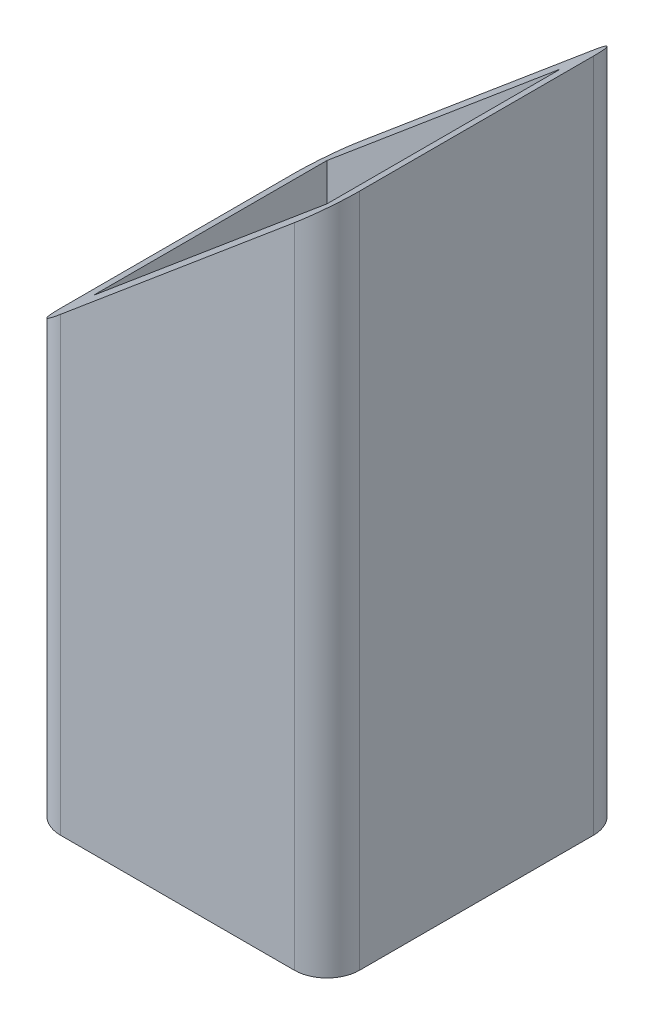
ISO-10303-21;
HEADER;
FILE_DESCRIPTION(('STEP AP214'),'2;1');
FILE_NAME('part.step','',(''),(''),'','','');
FILE_SCHEMA(('AUTOMOTIVE_DESIGN { 1 0 10303 214 1 1 1 1 }'));
ENDSEC;
DATA;
#1=APPLICATION_CONTEXT('core data for automotive mechanical design processes');
#2=APPLICATION_PROTOCOL_DEFINITION('international standard','automotive_design',2000,#1);
#3=PRODUCT_CONTEXT('',#1,'mechanical');
#4=PRODUCT('Part','Part','',(#3));
#5=PRODUCT_RELATED_PRODUCT_CATEGORY('part','',(#4));
#6=PRODUCT_DEFINITION_FORMATION('','',#4);
#7=PRODUCT_DEFINITION_CONTEXT('part definition',#1,'design');
#8=PRODUCT_DEFINITION('design','',#6,#7);
#9=PRODUCT_DEFINITION_SHAPE('','',#8);
#10=(LENGTH_UNIT() NAMED_UNIT(*) SI_UNIT(.MILLI.,.METRE.));
#11=(NAMED_UNIT(*) PLANE_ANGLE_UNIT() SI_UNIT($,.RADIAN.));
#12=(NAMED_UNIT(*) SI_UNIT($,.STERADIAN.) SOLID_ANGLE_UNIT());
#13=UNCERTAINTY_MEASURE_WITH_UNIT(LENGTH_MEASURE(1.E-05),#10,'distance_accuracy_value','');
#14=(GEOMETRIC_REPRESENTATION_CONTEXT(3) GLOBAL_UNCERTAINTY_ASSIGNED_CONTEXT((#13)) GLOBAL_UNIT_ASSIGNED_CONTEXT((#10,
#11,#12)) REPRESENTATION_CONTEXT('',''));
#15=CARTESIAN_POINT('',(0.,0.,0.));
#16=DIRECTION('',(0.,0.,1.));
#17=DIRECTION('',(1.,0.,0.));
#18=AXIS2_PLACEMENT_3D('',#15,#16,#17);
#19=CARTESIAN_POINT('',(22.8,60.,2.8));
#20=DIRECTION('',(0.,-1.,0.));
#21=DIRECTION('',(0.,0.,-1.));
#22=AXIS2_PLACEMENT_3D('',#19,#20,#21);
#23=CYLINDRICAL_SURFACE('',#22,2.8);
#24=DIRECTION('',(0.,-1.,0.));
#25=VECTOR('',#24,1.);
#26=CARTESIAN_POINT('',(22.8,60.,0.));
#27=LINE('',#26,#25);
#28=CARTESIAN_POINT('',(22.8,55.3674343113641,0.));
#29=VERTEX_POINT('',#28);
#30=CARTESIAN_POINT('',(22.8,0.,0.));
#31=VERTEX_POINT('',#30);
#32=EDGE_CURVE('E41',#29,#31,#27,.T.);
#33=ORIENTED_EDGE('',*,*,#32,.F.);
#34=CARTESIAN_POINT('',(22.8,55.3674343113642,2.8));
#35=DIRECTION('',(0.642909896112303,-0.765941815989222,0.));
#36=DIRECTION('',(-0.765941815989222,-0.642909896112303,0.));
#37=AXIS2_PLACEMENT_3D('',#34,#35,#36);
#38=ELLIPSE('',#37,3.6556301556454,2.8);
#39=CARTESIAN_POINT('',(25.6,57.7176751149551,2.80000000000002));
#40=VERTEX_POINT('',#39);
#41=EDGE_CURVE('E119',#29,#40,#38,.T.);
#42=ORIENTED_EDGE('',*,*,#41,.T.);
#43=DIRECTION('',(0.,-1.,0.));
#44=VECTOR('',#43,1.);
#45=CARTESIAN_POINT('',(25.6,60.,2.80000000000002));
#46=LINE('',#45,#44);
#47=CARTESIAN_POINT('',(25.6,0.,2.80000000000002));
#48=VERTEX_POINT('',#47);
#49=EDGE_CURVE('E154',#40,#48,#46,.T.);
#50=ORIENTED_EDGE('',*,*,#49,.T.);
#51=CARTESIAN_POINT('',(22.8,0.,2.8));
#52=DIRECTION('',(0.,1.,0.));
#53=DIRECTION('',(0.,0.,-1.));
#54=AXIS2_PLACEMENT_3D('',#51,#52,#53);
#55=CIRCLE('',#54,2.8);
#56=EDGE_CURVE('E141',#48,#31,#55,.T.);
#57=ORIENTED_EDGE('',*,*,#56,.T.);
#58=EDGE_LOOP('',(#33,#42,#50,#57));
#59=FACE_BOUND('',#58,.T.);
#60=ADVANCED_FACE('F34',(#59),#23,.T.);
#61=CARTESIAN_POINT('',(2.80000000000002,60.,0.));
#62=DIRECTION('',(0.,0.,1.));
#63=DIRECTION('',(1.,0.,0.));
#64=AXIS2_PLACEMENT_3D('',#61,#62,#63);
#65=PLANE('',#64);
#66=DIRECTION('',(0.,-1.,0.));
#67=VECTOR('',#66,1.);
#68=CARTESIAN_POINT('',(2.80000000000002,60.,0.));
#69=LINE('',#68,#67);
#70=CARTESIAN_POINT('',(2.8,38.58,0.));
#71=VERTEX_POINT('',#70);
#72=CARTESIAN_POINT('',(2.80000000000002,0.,0.));
#73=VERTEX_POINT('',#72);
#74=EDGE_CURVE('E135',#71,#73,#69,.T.);
#75=ORIENTED_EDGE('',*,*,#74,.F.);
#76=DIRECTION('',(-0.765941815989222,-0.642909896112303,0.));
#77=VECTOR('',#76,1.);
#78=CARTESIAN_POINT('',(-0.986658785791405,35.4015857186988,0.));
#79=LINE('',#78,#77);
#80=EDGE_CURVE('E122',#29,#71,#79,.T.);
#81=ORIENTED_EDGE('',*,*,#80,.F.);
#82=ORIENTED_EDGE('',*,*,#32,.T.);
#83=DIRECTION('',(-1.,0.,0.));
#84=VECTOR('',#83,1.);
#85=CARTESIAN_POINT('',(2.80000000000002,0.,0.));
#86=LINE('',#85,#84);
#87=EDGE_CURVE('E174',#31,#73,#86,.T.);
#88=ORIENTED_EDGE('',*,*,#87,.T.);
#89=EDGE_LOOP('',(#75,#81,#82,#88));
#90=FACE_BOUND('',#89,.T.);
#91=ADVANCED_FACE('F132',(#90),#65,.F.);
#92=CARTESIAN_POINT('',(2.8,60.,2.8));
#93=DIRECTION('',(0.,-1.,0.));
#94=DIRECTION('',(0.,0.,-1.));
#95=AXIS2_PLACEMENT_3D('',#92,#93,#94);
#96=CYLINDRICAL_SURFACE('',#95,2.8);
#97=DIRECTION('',(0.,-1.,0.));
#98=VECTOR('',#97,1.);
#99=CARTESIAN_POINT('',(0.,60.,2.80000000000002));
#100=LINE('',#99,#98);
#101=CARTESIAN_POINT('',(0.,36.229759196409,2.80000000000002));
#102=VERTEX_POINT('',#101);
#103=CARTESIAN_POINT('',(0.,0.,2.80000000000002));
#104=VERTEX_POINT('',#103);
#105=EDGE_CURVE('E142',#102,#104,#100,.T.);
#106=ORIENTED_EDGE('',*,*,#105,.F.);
#107=CARTESIAN_POINT('',(2.8,38.58,2.8));
#108=DIRECTION('',(0.642909896112303,-0.765941815989222,0.));
#109=DIRECTION('',(-0.765941815989222,-0.642909896112303,0.));
#110=AXIS2_PLACEMENT_3D('',#107,#108,#109);
#111=ELLIPSE('',#110,3.6556301556454,2.8);
#112=EDGE_CURVE('E197',#102,#71,#111,.T.);
#113=ORIENTED_EDGE('',*,*,#112,.T.);
#114=ORIENTED_EDGE('',*,*,#74,.T.);
#115=CARTESIAN_POINT('',(2.8,0.,2.8));
#116=DIRECTION('',(0.,1.,0.));
#117=DIRECTION('',(0.,0.,1.));
#118=AXIS2_PLACEMENT_3D('',#115,#116,#117);
#119=CIRCLE('',#118,2.8);
#120=EDGE_CURVE('E171',#73,#104,#119,.T.);
#121=ORIENTED_EDGE('',*,*,#120,.T.);
#122=EDGE_LOOP('',(#106,#113,#114,#121));
#123=FACE_BOUND('',#122,.T.);
#124=ADVANCED_FACE('F242',(#123),#96,.T.);
#125=CARTESIAN_POINT('',(0.,60.,2.80000000000002));
#126=DIRECTION('',(1.,0.,0.));
#127=DIRECTION('',(0.,0.,-1.));
#128=AXIS2_PLACEMENT_3D('',#125,#126,#127);
#129=PLANE('',#128);
#130=DIRECTION('',(0.,-1.,0.));
#131=VECTOR('',#130,1.);
#132=CARTESIAN_POINT('',(0.,60.,22.8));
#133=LINE('',#132,#131);
#134=CARTESIAN_POINT('',(0.,36.229759196409,22.8));
#135=VERTEX_POINT('',#134);
#136=CARTESIAN_POINT('',(0.,0.,22.8));
#137=VERTEX_POINT('',#136);
#138=EDGE_CURVE('E146',#135,#137,#133,.T.);
#139=ORIENTED_EDGE('',*,*,#138,.F.);
#140=DIRECTION('',(0.,0.,-1.));
#141=VECTOR('',#140,1.);
#142=CARTESIAN_POINT('',(0.,36.229759196409,2.80000000000002));
#143=LINE('',#142,#141);
#144=EDGE_CURVE('E199',#135,#102,#143,.T.);
#145=ORIENTED_EDGE('',*,*,#144,.T.);
#146=ORIENTED_EDGE('',*,*,#105,.T.);
#147=DIRECTION('',(0.,0.,1.));
#148=VECTOR('',#147,1.);
#149=CARTESIAN_POINT('',(0.,0.,2.80000000000002));
#150=LINE('',#149,#148);
#151=EDGE_CURVE('E168',#104,#137,#150,.T.);
#152=ORIENTED_EDGE('',*,*,#151,.T.);
#153=EDGE_LOOP('',(#139,#145,#146,#152));
#154=FACE_BOUND('',#153,.T.);
#155=ADVANCED_FACE('F246',(#154),#129,.F.);
#156=CARTESIAN_POINT('',(2.8,60.,22.8));
#157=DIRECTION('',(0.,-1.,0.));
#158=DIRECTION('',(0.,0.,-1.));
#159=AXIS2_PLACEMENT_3D('',#156,#157,#158);
#160=CYLINDRICAL_SURFACE('',#159,2.8);
#161=DIRECTION('',(0.,-1.,0.));
#162=VECTOR('',#161,1.);
#163=CARTESIAN_POINT('',(2.80000000000002,60.,25.6));
#164=LINE('',#163,#162);
#165=CARTESIAN_POINT('',(2.80000000000002,38.58,25.6));
#166=VERTEX_POINT('',#165);
#167=CARTESIAN_POINT('',(2.80000000000002,0.,25.6));
#168=VERTEX_POINT('',#167);
#169=EDGE_CURVE('E148',#166,#168,#164,.T.);
#170=ORIENTED_EDGE('',*,*,#169,.F.);
#171=CARTESIAN_POINT('',(2.8,38.58,22.8));
#172=DIRECTION('',(0.642909896112303,-0.765941815989222,0.));
#173=DIRECTION('',(-0.765941815989222,-0.642909896112303,0.));
#174=AXIS2_PLACEMENT_3D('',#171,#172,#173);
#175=ELLIPSE('',#174,3.6556301556454,2.8);
#176=EDGE_CURVE('E128',#166,#135,#175,.T.);
#177=ORIENTED_EDGE('',*,*,#176,.T.);
#178=ORIENTED_EDGE('',*,*,#138,.T.);
#179=CARTESIAN_POINT('',(2.8,0.,22.8));
#180=DIRECTION('',(0.,1.,0.));
#181=DIRECTION('',(0.,0.,1.));
#182=AXIS2_PLACEMENT_3D('',#179,#180,#181);
#183=CIRCLE('',#182,2.8);
#184=EDGE_CURVE('E165',#137,#168,#183,.T.);
#185=ORIENTED_EDGE('',*,*,#184,.T.);
#186=EDGE_LOOP('',(#170,#177,#178,#185));
#187=FACE_BOUND('',#186,.T.);
#188=ADVANCED_FACE('F252',(#187),#160,.T.);
#189=CARTESIAN_POINT('',(2.80000000000002,60.,25.6));
#190=DIRECTION('',(0.,0.,-1.));
#191=DIRECTION('',(-1.,0.,0.));
#192=AXIS2_PLACEMENT_3D('',#189,#190,#191);
#193=PLANE('',#192);
#194=DIRECTION('',(0.,-1.,0.));
#195=VECTOR('',#194,1.);
#196=CARTESIAN_POINT('',(22.8,60.,25.6));
#197=LINE('',#196,#195);
#198=CARTESIAN_POINT('',(22.8,55.3674343113642,25.6));
#199=VERTEX_POINT('',#198);
#200=CARTESIAN_POINT('',(22.8,0.,25.6));
#201=VERTEX_POINT('',#200);
#202=EDGE_CURVE('E150',#199,#201,#197,.T.);
#203=ORIENTED_EDGE('',*,*,#202,.F.);
#204=DIRECTION('',(0.765941815989222,0.642909896112303,0.));
#205=VECTOR('',#204,1.);
#206=CARTESIAN_POINT('',(-0.986658785791405,35.4015857186988,25.6));
#207=LINE('',#206,#205);
#208=EDGE_CURVE('E137',#166,#199,#207,.T.);
#209=ORIENTED_EDGE('',*,*,#208,.F.);
#210=ORIENTED_EDGE('',*,*,#169,.T.);
#211=DIRECTION('',(1.,0.,0.));
#212=VECTOR('',#211,1.);
#213=CARTESIAN_POINT('',(2.80000000000002,0.,25.6));
#214=LINE('',#213,#212);
#215=EDGE_CURVE('E162',#168,#201,#214,.T.);
#216=ORIENTED_EDGE('',*,*,#215,.T.);
#217=EDGE_LOOP('',(#203,#209,#210,#216));
#218=FACE_BOUND('',#217,.T.);
#219=ADVANCED_FACE('F219',(#218),#193,.F.);
#220=CARTESIAN_POINT('',(22.8,60.,22.8));
#221=DIRECTION('',(0.,-1.,0.));
#222=DIRECTION('',(0.,0.,-1.));
#223=AXIS2_PLACEMENT_3D('',#220,#221,#222);
#224=CYLINDRICAL_SURFACE('',#223,2.8);
#225=DIRECTION('',(0.,-1.,0.));
#226=VECTOR('',#225,1.);
#227=CARTESIAN_POINT('',(25.6,60.,22.8));
#228=LINE('',#227,#226);
#229=CARTESIAN_POINT('',(25.6,57.7176751149551,22.8));
#230=VERTEX_POINT('',#229);
#231=CARTESIAN_POINT('',(25.6,0.,22.8));
#232=VERTEX_POINT('',#231);
#233=EDGE_CURVE('E152',#230,#232,#228,.T.);
#234=ORIENTED_EDGE('',*,*,#233,.F.);
#235=CARTESIAN_POINT('',(22.8,55.3674343113642,22.8));
#236=DIRECTION('',(0.642909896112303,-0.765941815989222,0.));
#237=DIRECTION('',(-0.765941815989222,-0.642909896112303,0.));
#238=AXIS2_PLACEMENT_3D('',#235,#236,#237);
#239=ELLIPSE('',#238,3.6556301556454,2.8);
#240=EDGE_CURVE('E48',#230,#199,#239,.T.);
#241=ORIENTED_EDGE('',*,*,#240,.T.);
#242=ORIENTED_EDGE('',*,*,#202,.T.);
#243=CARTESIAN_POINT('',(22.8,0.,22.8));
#244=DIRECTION('',(0.,1.,0.));
#245=DIRECTION('',(0.,0.,1.));
#246=AXIS2_PLACEMENT_3D('',#243,#244,#245);
#247=CIRCLE('',#246,2.8);
#248=EDGE_CURVE('E159',#201,#232,#247,.T.);
#249=ORIENTED_EDGE('',*,*,#248,.T.);
#250=EDGE_LOOP('',(#234,#241,#242,#249));
#251=FACE_BOUND('',#250,.T.);
#252=ADVANCED_FACE('F218',(#251),#224,.T.);
#253=CARTESIAN_POINT('',(25.6,60.,2.80000000000002));
#254=DIRECTION('',(-1.,0.,0.));
#255=DIRECTION('',(0.,0.,1.));
#256=AXIS2_PLACEMENT_3D('',#253,#254,#255);
#257=PLANE('',#256);
#258=ORIENTED_EDGE('',*,*,#49,.F.);
#259=DIRECTION('',(0.,0.,1.));
#260=VECTOR('',#259,1.);
#261=CARTESIAN_POINT('',(25.6,57.7176751149551,2.80000000000002));
#262=LINE('',#261,#260);
#263=EDGE_CURVE('E124',#40,#230,#262,.T.);
#264=ORIENTED_EDGE('',*,*,#263,.T.);
#265=ORIENTED_EDGE('',*,*,#233,.T.);
#266=DIRECTION('',(0.,0.,-1.));
#267=VECTOR('',#266,1.);
#268=CARTESIAN_POINT('',(25.6,0.,2.80000000000002));
#269=LINE('',#268,#267);
#270=EDGE_CURVE('E156',#232,#48,#269,.T.);
#271=ORIENTED_EDGE('',*,*,#270,.T.);
#272=EDGE_LOOP('',(#258,#264,#265,#271));
#273=FACE_BOUND('',#272,.T.);
#274=ADVANCED_FACE('F227',(#273),#257,.F.);
#275=CARTESIAN_POINT('',(22.8,0.,2.8));
#276=DIRECTION('',(0.,-1.,0.));
#277=DIRECTION('',(0.,0.,-1.));
#278=AXIS2_PLACEMENT_3D('',#275,#276,#277);
#279=PLANE('',#278);
#280=DIRECTION('',(0.,0.,1.));
#281=VECTOR('',#280,1.);
#282=CARTESIAN_POINT('',(22.8,0.,2.8));
#283=LINE('',#282,#281);
#284=CARTESIAN_POINT('',(22.8,0.,2.8));
#285=VERTEX_POINT('',#284);
#286=CARTESIAN_POINT('',(22.8,0.,22.8));
#287=VERTEX_POINT('',#286);
#288=EDGE_CURVE('E194',#285,#287,#283,.T.);
#289=ORIENTED_EDGE('',*,*,#288,.F.);
#290=DIRECTION('',(1.,0.,0.));
#291=VECTOR('',#290,1.);
#292=CARTESIAN_POINT('',(2.8,0.,2.8));
#293=LINE('',#292,#291);
#294=CARTESIAN_POINT('',(2.8,0.,2.8));
#295=VERTEX_POINT('',#294);
#296=EDGE_CURVE('E181',#295,#285,#293,.T.);
#297=ORIENTED_EDGE('',*,*,#296,.F.);
#298=DIRECTION('',(0.,0.,-1.));
#299=VECTOR('',#298,1.);
#300=CARTESIAN_POINT('',(2.8,0.,2.8));
#301=LINE('',#300,#299);
#302=CARTESIAN_POINT('',(2.8,0.,22.8));
#303=VERTEX_POINT('',#302);
#304=EDGE_CURVE('E188',#303,#295,#301,.T.);
#305=ORIENTED_EDGE('',*,*,#304,.F.);
#306=DIRECTION('',(-1.,0.,0.));
#307=VECTOR('',#306,1.);
#308=CARTESIAN_POINT('',(2.8,0.,22.8));
#309=LINE('',#308,#307);
#310=EDGE_CURVE('E191',#287,#303,#309,.T.);
#311=ORIENTED_EDGE('',*,*,#310,.F.);
#312=EDGE_LOOP('',(#289,#297,#305,#311));
#313=FACE_BOUND('',#312,.T.);
#314=ORIENTED_EDGE('',*,*,#56,.F.);
#315=ORIENTED_EDGE('',*,*,#270,.F.);
#316=ORIENTED_EDGE('',*,*,#248,.F.);
#317=ORIENTED_EDGE('',*,*,#215,.F.);
#318=ORIENTED_EDGE('',*,*,#184,.F.);
#319=ORIENTED_EDGE('',*,*,#151,.F.);
#320=ORIENTED_EDGE('',*,*,#120,.F.);
#321=ORIENTED_EDGE('',*,*,#87,.F.);
#322=EDGE_LOOP('',(#314,#315,#316,#317,#318,#319,#320,#321));
#323=FACE_BOUND('',#322,.T.);
#324=ADVANCED_FACE('F225',(#313,#323),#279,.T.);
#325=CARTESIAN_POINT('',(22.8,1040.5,2.8));
#326=DIRECTION('',(1.,0.,0.));
#327=DIRECTION('',(0.,0.,-1.));
#328=AXIS2_PLACEMENT_3D('',#325,#326,#327);
#329=PLANE('',#328);
#330=DIRECTION('',(0.,-1.,0.));
#331=VECTOR('',#330,1.);
#332=CARTESIAN_POINT('',(22.8,1040.5,22.8));
#333=LINE('',#332,#331);
#334=CARTESIAN_POINT('',(22.8,55.3674343113642,22.8));
#335=VERTEX_POINT('',#334);
#336=EDGE_CURVE('E178',#335,#287,#333,.T.);
#337=ORIENTED_EDGE('',*,*,#336,.F.);
#338=DIRECTION('',(0.,0.,-1.));
#339=VECTOR('',#338,1.);
#340=CARTESIAN_POINT('',(22.8,55.3674343113643,2.79999999999971));
#341=LINE('',#340,#339);
#342=CARTESIAN_POINT('',(22.8,55.3674343113641,2.8));
#343=VERTEX_POINT('',#342);
#344=EDGE_CURVE('E56',#335,#343,#341,.T.);
#345=ORIENTED_EDGE('',*,*,#344,.T.);
#346=DIRECTION('',(0.,-1.,0.));
#347=VECTOR('',#346,1.);
#348=CARTESIAN_POINT('',(22.8,1040.5,2.8));
#349=LINE('',#348,#347);
#350=EDGE_CURVE('E177',#343,#285,#349,.T.);
#351=ORIENTED_EDGE('',*,*,#350,.T.);
#352=ORIENTED_EDGE('',*,*,#288,.T.);
#353=EDGE_LOOP('',(#337,#345,#351,#352));
#354=FACE_BOUND('',#353,.T.);
#355=ADVANCED_FACE('F234',(#354),#329,.F.);
#356=CARTESIAN_POINT('',(2.8,1040.5,2.8));
#357=DIRECTION('',(0.,0.,-1.));
#358=DIRECTION('',(-1.,0.,0.));
#359=AXIS2_PLACEMENT_3D('',#356,#357,#358);
#360=PLANE('',#359);
#361=ORIENTED_EDGE('',*,*,#350,.F.);
#362=DIRECTION('',(-0.765941815989222,-0.642909896112303,0.));
#363=VECTOR('',#362,1.);
#364=CARTESIAN_POINT('',(496.177041966523,452.706734137409,2.80000000000007));
#365=LINE('',#364,#363);
#366=CARTESIAN_POINT('',(2.8,38.5800000000001,2.8));
#367=VERTEX_POINT('',#366);
#368=EDGE_CURVE('E207',#343,#367,#365,.T.);
#369=ORIENTED_EDGE('',*,*,#368,.T.);
#370=DIRECTION('',(0.,-1.,0.));
#371=VECTOR('',#370,1.);
#372=CARTESIAN_POINT('',(2.8,1040.5,2.8));
#373=LINE('',#372,#371);
#374=EDGE_CURVE('E183',#367,#295,#373,.T.);
#375=ORIENTED_EDGE('',*,*,#374,.T.);
#376=ORIENTED_EDGE('',*,*,#296,.T.);
#377=EDGE_LOOP('',(#361,#369,#375,#376));
#378=FACE_BOUND('',#377,.T.);
#379=ADVANCED_FACE('F280',(#378),#360,.F.);
#380=CARTESIAN_POINT('',(2.8,1040.5,2.8));
#381=DIRECTION('',(-1.,0.,0.));
#382=DIRECTION('',(0.,0.,1.));
#383=AXIS2_PLACEMENT_3D('',#380,#381,#382);
#384=PLANE('',#383);
#385=ORIENTED_EDGE('',*,*,#374,.F.);
#386=DIRECTION('',(0.,0.,1.));
#387=VECTOR('',#386,1.);
#388=CARTESIAN_POINT('',(2.8,38.5800000000001,2.79999999999972));
#389=LINE('',#388,#387);
#390=CARTESIAN_POINT('',(2.79999999999997,38.5799999999998,22.8));
#391=VERTEX_POINT('',#390);
#392=EDGE_CURVE('E136',#367,#391,#389,.T.);
#393=ORIENTED_EDGE('',*,*,#392,.T.);
#394=DIRECTION('',(0.,-1.,0.));
#395=VECTOR('',#394,1.);
#396=CARTESIAN_POINT('',(2.8,1040.5,22.8));
#397=LINE('',#396,#395);
#398=EDGE_CURVE('E180',#391,#303,#397,.T.);
#399=ORIENTED_EDGE('',*,*,#398,.T.);
#400=ORIENTED_EDGE('',*,*,#304,.T.);
#401=EDGE_LOOP('',(#385,#393,#399,#400));
#402=FACE_BOUND('',#401,.T.);
#403=ADVANCED_FACE('F290',(#402),#384,.F.);
#404=CARTESIAN_POINT('',(2.8,1040.5,22.8));
#405=DIRECTION('',(0.,0.,1.));
#406=DIRECTION('',(1.,0.,0.));
#407=AXIS2_PLACEMENT_3D('',#404,#405,#406);
#408=PLANE('',#407);
#409=ORIENTED_EDGE('',*,*,#398,.F.);
#410=DIRECTION('',(0.765941815989222,0.642909896112303,0.));
#411=VECTOR('',#410,1.);
#412=CARTESIAN_POINT('',(496.177041966523,452.706734137409,22.8000000000001));
#413=LINE('',#412,#411);
#414=EDGE_CURVE('E11',#391,#335,#413,.T.);
#415=ORIENTED_EDGE('',*,*,#414,.T.);
#416=ORIENTED_EDGE('',*,*,#336,.T.);
#417=ORIENTED_EDGE('',*,*,#310,.T.);
#418=EDGE_LOOP('',(#409,#415,#416,#417));
#419=FACE_BOUND('',#418,.T.);
#420=ADVANCED_FACE('F300',(#419),#408,.F.);
#421=CARTESIAN_POINT('',(-0.986658785791405,35.4015857186988,-37.2769071208465));
#422=DIRECTION('',(0.642909896112303,-0.765941815989222,0.));
#423=DIRECTION('',(0.765941815989222,0.642909896112303,0.));
#424=AXIS2_PLACEMENT_3D('',#421,#422,#423);
#425=PLANE('',#424);
#426=ORIENTED_EDGE('',*,*,#414,.F.);
#427=ORIENTED_EDGE('',*,*,#392,.F.);
#428=ORIENTED_EDGE('',*,*,#368,.F.);
#429=ORIENTED_EDGE('',*,*,#344,.F.);
#430=EDGE_LOOP('',(#426,#427,#428,#429));
#431=FACE_BOUND('',#430,.T.);
#432=ORIENTED_EDGE('',*,*,#144,.F.);
#433=ORIENTED_EDGE('',*,*,#176,.F.);
#434=ORIENTED_EDGE('',*,*,#208,.T.);
#435=ORIENTED_EDGE('',*,*,#240,.F.);
#436=ORIENTED_EDGE('',*,*,#263,.F.);
#437=ORIENTED_EDGE('',*,*,#41,.F.);
#438=ORIENTED_EDGE('',*,*,#80,.T.);
#439=ORIENTED_EDGE('',*,*,#112,.F.);
#440=EDGE_LOOP('',(#432,#433,#434,#435,#436,#437,#438,#439));
#441=FACE_BOUND('',#440,.T.);
#442=ADVANCED_FACE('F121',(#431,#441),#425,.F.);
#443=CLOSED_SHELL('',(#60,#91,#124,#155,#188,#219,#252,#274,#324,#355,#379,#403,#420,#442));
#444=MANIFOLD_SOLID_BREP('B2',#443);
#445=ADVANCED_BREP_SHAPE_REPRESENTATION('',(#18,#444),#14);
#446=SHAPE_DEFINITION_REPRESENTATION(#9,#445);
ENDSEC;
END-ISO-10303-21;
